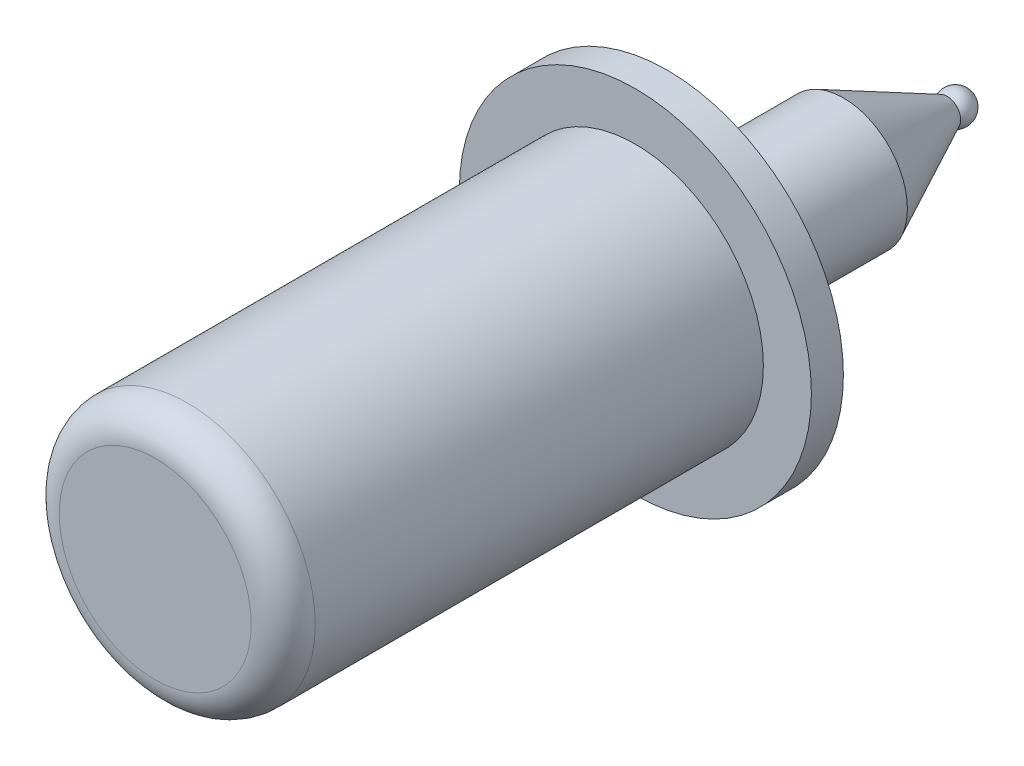
ISO-10303-21;
HEADER;
FILE_DESCRIPTION(('STEP AP214'),'2;1');
FILE_NAME('part.step','',(''),(''),'','','');
FILE_SCHEMA(('AUTOMOTIVE_DESIGN { 1 0 10303 214 1 1 1 1 }'));
ENDSEC;
DATA;
#1=APPLICATION_CONTEXT('core data for automotive mechanical design processes');
#2=APPLICATION_PROTOCOL_DEFINITION('international standard','automotive_design',2000,#1);
#3=PRODUCT_CONTEXT('',#1,'mechanical');
#4=PRODUCT('Part','Part','',(#3));
#5=PRODUCT_RELATED_PRODUCT_CATEGORY('part','',(#4));
#6=PRODUCT_DEFINITION_FORMATION('','',#4);
#7=PRODUCT_DEFINITION_CONTEXT('part definition',#1,'design');
#8=PRODUCT_DEFINITION('design','',#6,#7);
#9=PRODUCT_DEFINITION_SHAPE('','',#8);
#10=(LENGTH_UNIT() NAMED_UNIT(*) SI_UNIT(.MILLI.,.METRE.));
#11=(NAMED_UNIT(*) PLANE_ANGLE_UNIT() SI_UNIT($,.RADIAN.));
#12=(NAMED_UNIT(*) SI_UNIT($,.STERADIAN.) SOLID_ANGLE_UNIT());
#13=UNCERTAINTY_MEASURE_WITH_UNIT(LENGTH_MEASURE(1.E-05),#10,'distance_accuracy_value','');
#14=(GEOMETRIC_REPRESENTATION_CONTEXT(3) GLOBAL_UNCERTAINTY_ASSIGNED_CONTEXT((#13)) GLOBAL_UNIT_ASSIGNED_CONTEXT((#10,
#11,#12)) REPRESENTATION_CONTEXT('',''));
#15=CARTESIAN_POINT('',(0.,0.,0.));
#16=DIRECTION('',(0.,0.,1.));
#17=DIRECTION('',(1.,0.,0.));
#18=AXIS2_PLACEMENT_3D('',#15,#16,#17);
#19=CARTESIAN_POINT('',(0.,0.,-25.));
#20=DIRECTION('',(0.,0.,1.));
#21=DIRECTION('',(0.,-1.,0.));
#22=AXIS2_PLACEMENT_3D('',#19,#20,#21);
#23=SPHERICAL_SURFACE('',#22,0.5);
#24=CARTESIAN_POINT('',(0.,0.,-24.7389715071817));
#25=DIRECTION('',(0.,0.,1.));
#26=DIRECTION('',(1.,0.,0.));
#27=AXIS2_PLACEMENT_3D('',#24,#25,#26);
#28=CIRCLE('',#27,0.426455303563013);
#29=CARTESIAN_POINT('',(0.426455303563012,0.,-24.7389715071817));
#30=VERTEX_POINT('',#29);
#31=EDGE_CURVE('E10',#30,#30,#28,.T.);
#32=ORIENTED_EDGE('',*,*,#31,.F.);
#33=EDGE_LOOP('',(#32));
#34=FACE_BOUND('',#33,.T.);
#35=ADVANCED_FACE('F32',(#34),#23,.T.);
#36=CARTESIAN_POINT('',(0.,0.,-24.7389715071817));
#37=DIRECTION('',(0.,0.,1.));
#38=DIRECTION('',(1.,0.,0.));
#39=AXIS2_PLACEMENT_3D('',#36,#37,#38);
#40=CONICAL_SURFACE('',#39,0.426455303563013,0.452236286108772);
#41=CARTESIAN_POINT('',(0.,0.,-21.5));
#42=DIRECTION('',(0.,0.,1.));
#43=DIRECTION('',(1.,0.,0.));
#44=AXIS2_PLACEMENT_3D('',#41,#42,#43);
#45=CIRCLE('',#44,2.);
#46=CARTESIAN_POINT('',(2.,0.,-21.5));
#47=VERTEX_POINT('',#46);
#48=EDGE_CURVE('E38',#47,#47,#45,.T.);
#49=CARTESIAN_POINT('',(2.,0.,-21.5));
#50=CARTESIAN_POINT('',(1.98360890941212,0.,-21.5337392865331));
#51=CARTESIAN_POINT('',(1.96721781882423,0.,-21.5674785730663));
#52=CARTESIAN_POINT('',(1.93443563764846,0.,-21.6349571461326));
#53=CARTESIAN_POINT('',(1.91804454706058,0.,-21.6686964326657));
#54=CARTESIAN_POINT('',(1.8852623658848,0.,-21.736175005732));
#55=CARTESIAN_POINT('',(1.86887127529692,0.,-21.7699142922651));
#56=CARTESIAN_POINT('',(1.83608909412115,0.,-21.8373928653314));
#57=CARTESIAN_POINT('',(1.81969800353326,0.,-21.8711321518646));
#58=CARTESIAN_POINT('',(1.78691582235749,0.,-21.9386107249309));
#59=CARTESIAN_POINT('',(1.77052473176961,0.,-21.972350011464));
#60=CARTESIAN_POINT('',(1.73774255059384,0.,-22.0398285845303));
#61=CARTESIAN_POINT('',(1.72135146000595,0.,-22.0735678710634));
#62=CARTESIAN_POINT('',(1.68856927883018,0.,-22.1410464441297));
#63=CARTESIAN_POINT('',(1.6721781882423,0.,-22.1747857306629));
#64=CARTESIAN_POINT('',(1.63939600706652,0.,-22.2422643037292));
#65=CARTESIAN_POINT('',(1.62300491647864,0.,-22.2760035902623));
#66=CARTESIAN_POINT('',(1.59022273530287,0.,-22.3434821633286));
#67=CARTESIAN_POINT('',(1.57383164471498,0.,-22.3772214498617));
#68=CARTESIAN_POINT('',(1.54104946353921,0.,-22.444700022928));
#69=CARTESIAN_POINT('',(1.52465837295133,0.,-22.4784393094612));
#70=CARTESIAN_POINT('',(1.49187619177556,0.,-22.5459178825274));
#71=CARTESIAN_POINT('',(1.47548510118767,0.,-22.5796571690606));
#72=CARTESIAN_POINT('',(1.4427029200119,0.,-22.6471357421269));
#73=CARTESIAN_POINT('',(1.42631182942402,0.,-22.68087502866));
#74=CARTESIAN_POINT('',(1.39352964824824,0.,-22.7483536017263));
#75=CARTESIAN_POINT('',(1.37713855766036,0.,-22.7820928882594));
#76=CARTESIAN_POINT('',(1.34435637648459,0.,-22.8495714613257));
#77=CARTESIAN_POINT('',(1.3279652858967,0.,-22.8833107478589));
#78=CARTESIAN_POINT('',(1.29518310472093,0.,-22.9507893209251));
#79=CARTESIAN_POINT('',(1.27879201413305,0.,-22.9845286074583));
#80=CARTESIAN_POINT('',(1.24600983295728,0.,-23.0520071805246));
#81=CARTESIAN_POINT('',(1.22961874236939,0.,-23.0857464670577));
#82=CARTESIAN_POINT('',(1.19683656119362,0.,-23.153225040124));
#83=CARTESIAN_POINT('',(1.18044547060574,0.,-23.1869643266572));
#84=CARTESIAN_POINT('',(1.14766328942997,0.,-23.2544428997234));
#85=CARTESIAN_POINT('',(1.13127219884208,0.,-23.2881821862566));
#86=CARTESIAN_POINT('',(1.09849001766631,0.,-23.3556607593229));
#87=CARTESIAN_POINT('',(1.08209892707842,0.,-23.389400045856));
#88=CARTESIAN_POINT('',(1.04931674590265,0.,-23.4568786189223));
#89=CARTESIAN_POINT('',(1.03292565531477,0.,-23.4906179054554));
#90=CARTESIAN_POINT('',(1.000143474139,0.,-23.5580964785217));
#91=CARTESIAN_POINT('',(0.983752383551112,0.,-23.5918357650549));
#92=CARTESIAN_POINT('',(0.950970202375341,0.,-23.6593143381212));
#93=CARTESIAN_POINT('',(0.934579111787457,0.,-23.6930536246543));
#94=CARTESIAN_POINT('',(0.901796930611686,0.,-23.7605321977206));
#95=CARTESIAN_POINT('',(0.8854058400238,0.,-23.7942714842537));
#96=CARTESIAN_POINT('',(0.852623658848029,0.,-23.86175005732));
#97=CARTESIAN_POINT('',(0.836232568260144,0.,-23.8954893438532));
#98=CARTESIAN_POINT('',(0.803450387084374,0.,-23.9629679169194));
#99=CARTESIAN_POINT('',(0.787059296496489,0.,-23.9967072034526));
#100=CARTESIAN_POINT('',(0.754277115320718,0.,-24.0641857765189));
#101=CARTESIAN_POINT('',(0.737886024732832,0.,-24.097925063052));
#102=CARTESIAN_POINT('',(0.705103843557062,0.,-24.1654036361183));
#103=CARTESIAN_POINT('',(0.688712752969177,0.,-24.1991429226514));
#104=CARTESIAN_POINT('',(0.655930571793406,0.,-24.2666214957177));
#105=CARTESIAN_POINT('',(0.639539481205521,0.,-24.3003607822509));
#106=CARTESIAN_POINT('',(0.60675730002975,0.,-24.3678393553172));
#107=CARTESIAN_POINT('',(0.590366209441865,0.,-24.4015786418503));
#108=CARTESIAN_POINT('',(0.557584028266095,0.,-24.4690572149166));
#109=CARTESIAN_POINT('',(0.541192937678209,0.,-24.5027965014497));
#110=CARTESIAN_POINT('',(0.508410756502438,0.,-24.570275074516));
#111=CARTESIAN_POINT('',(0.492019665914553,0.,-24.6040143610492));
#112=CARTESIAN_POINT('',(0.459237484738782,0.,-24.6714929341154));
#113=CARTESIAN_POINT('',(0.442846394150897,0.,-24.7052322206486));
#114=CARTESIAN_POINT('',(0.426455303563012,0.,-24.7389715071817));
#115=B_SPLINE_CURVE_WITH_KNOTS('',3,(#49,#50,#51,#52,#53,#54,#55,#56,#57,#58,#59,#60,#61,#62,
#63,#64,#65,#66,#67,#68,#69,#70,#71,#72,#73,#74,#75,#76,#77,#78,#79,#80,#81,#82,#83,#84,#85,#86,
#87,#88,#89,#90,#91,#92,#93,#94,#95,#96,#97,#98,#99,#100,#101,#102,#103,#104,#105,#106,#107,
#108,#109,#110,#111,#112,#113,#114),.UNSPECIFIED.,.F.,.F.,(4,2,2,2,2,2,2,2,2,2,2,2,2,2,2,2,2,2,
2,2,2,2,2,2,2,2,2,2,2,2,2,2,4),(0.,0.112530288179813,0.225060576359628,0.337590864539441,
0.450121152719257,0.562651440899069,0.675181729078885,0.787712017258701,0.900242305438514,
1.01277259361833,1.12530288179814,1.23783316997796,1.35036345815777,1.46289374633759,
1.5754240345174,1.68795432269721,1.80048461087703,1.91301489905684,2.02554518723666,
2.13807547541647,2.25060576359629,2.3631360517761,2.47566633995592,2.58819662813573,
2.70072691631554,2.81325720449536,2.92578749267517,3.03831778085499,3.1508480690348,
3.26337835721462,3.37590864539443,3.48843893357425,3.60096922175406),.UNSPECIFIED.);
#116=EDGE_CURVE('BSEAM98',#47,#30,#115,.T.);
#117=ORIENTED_EDGE('',*,*,#48,.F.);
#118=ORIENTED_EDGE('',*,*,#31,.T.);
#119=ORIENTED_EDGE('',*,*,#116,.T.);
#120=ORIENTED_EDGE('',*,*,#116,.F.);
#121=EDGE_LOOP('',(#117,#119,#118,#120));
#122=FACE_BOUND('',#121,.T.);
#123=ADVANCED_FACE('F98',(#122),#40,.T.);
#124=CARTESIAN_POINT('',(0.,0.,0.));
#125=DIRECTION('',(0.,0.,1.));
#126=DIRECTION('',(1.,0.,0.));
#127=AXIS2_PLACEMENT_3D('',#124,#125,#126);
#128=CYLINDRICAL_SURFACE('',#127,2.);
#129=CARTESIAN_POINT('',(0.,0.,-16.));
#130=DIRECTION('',(0.,0.,1.));
#131=DIRECTION('',(1.,0.,0.));
#132=AXIS2_PLACEMENT_3D('',#129,#130,#131);
#133=CIRCLE('',#132,2.);
#134=CARTESIAN_POINT('',(2.,0.,-16.));
#135=VERTEX_POINT('',#134);
#136=EDGE_CURVE('E42',#135,#135,#133,.T.);
#137=ORIENTED_EDGE('',*,*,#136,.F.);
#138=EDGE_LOOP('',(#137));
#139=FACE_BOUND('',#138,.T.);
#140=ORIENTED_EDGE('',*,*,#48,.T.);
#141=EDGE_LOOP('',(#140));
#142=FACE_BOUND('',#141,.T.);
#143=ADVANCED_FACE('F93',(#139,#142),#128,.T.);
#144=CARTESIAN_POINT('',(0.,5.5,-16.));
#145=DIRECTION('',(0.,0.,1.));
#146=DIRECTION('',(1.,0.,0.));
#147=AXIS2_PLACEMENT_3D('',#144,#145,#146);
#148=PLANE('',#147);
#149=CARTESIAN_POINT('',(0.,0.,-16.));
#150=DIRECTION('',(0.,0.,1.));
#151=DIRECTION('',(1.,0.,0.));
#152=AXIS2_PLACEMENT_3D('',#149,#150,#151);
#153=CIRCLE('',#152,5.5);
#154=CARTESIAN_POINT('',(5.5,0.,-16.));
#155=VERTEX_POINT('',#154);
#156=EDGE_CURVE('E46',#155,#155,#153,.T.);
#157=ORIENTED_EDGE('',*,*,#156,.F.);
#158=EDGE_LOOP('',(#157));
#159=FACE_BOUND('',#158,.T.);
#160=ORIENTED_EDGE('',*,*,#136,.T.);
#161=EDGE_LOOP('',(#160));
#162=FACE_BOUND('',#161,.T.);
#163=ADVANCED_FACE('F87',(#159,#162),#148,.F.);
#164=CARTESIAN_POINT('',(0.,0.,0.));
#165=DIRECTION('',(0.,0.,1.));
#166=DIRECTION('',(1.,0.,0.));
#167=AXIS2_PLACEMENT_3D('',#164,#165,#166);
#168=CYLINDRICAL_SURFACE('',#167,5.5);
#169=CARTESIAN_POINT('',(0.,0.,-15.));
#170=DIRECTION('',(0.,0.,1.));
#171=DIRECTION('',(1.,0.,0.));
#172=AXIS2_PLACEMENT_3D('',#169,#170,#171);
#173=CIRCLE('',#172,5.5);
#174=CARTESIAN_POINT('',(5.5,0.,-15.));
#175=VERTEX_POINT('',#174);
#176=EDGE_CURVE('E51',#175,#175,#173,.T.);
#177=ORIENTED_EDGE('',*,*,#176,.F.);
#178=EDGE_LOOP('',(#177));
#179=FACE_BOUND('',#178,.T.);
#180=ORIENTED_EDGE('',*,*,#156,.T.);
#181=EDGE_LOOP('',(#180));
#182=FACE_BOUND('',#181,.T.);
#183=ADVANCED_FACE('F81',(#179,#182),#168,.T.);
#184=CARTESIAN_POINT('',(0.,4.,-15.));
#185=DIRECTION('',(0.,0.,-1.));
#186=DIRECTION('',(-1.,0.,0.));
#187=AXIS2_PLACEMENT_3D('',#184,#185,#186);
#188=PLANE('',#187);
#189=CARTESIAN_POINT('',(0.,0.,-15.));
#190=DIRECTION('',(0.,0.,1.));
#191=DIRECTION('',(1.,0.,0.));
#192=AXIS2_PLACEMENT_3D('',#189,#190,#191);
#193=CIRCLE('',#192,4.);
#194=CARTESIAN_POINT('',(4.,0.,-15.));
#195=VERTEX_POINT('',#194);
#196=EDGE_CURVE('E54',#195,#195,#193,.T.);
#197=ORIENTED_EDGE('',*,*,#196,.F.);
#198=EDGE_LOOP('',(#197));
#199=FACE_BOUND('',#198,.T.);
#200=ORIENTED_EDGE('',*,*,#176,.T.);
#201=EDGE_LOOP('',(#200));
#202=FACE_BOUND('',#201,.T.);
#203=ADVANCED_FACE('F75',(#199,#202),#188,.F.);
#204=CARTESIAN_POINT('',(0.,0.,0.));
#205=DIRECTION('',(0.,0.,1.));
#206=DIRECTION('',(1.,0.,0.));
#207=AXIS2_PLACEMENT_3D('',#204,#205,#206);
#208=CYLINDRICAL_SURFACE('',#207,4.);
#209=CARTESIAN_POINT('',(0.,0.,-1.));
#210=DIRECTION('',(0.,0.,1.));
#211=DIRECTION('',(1.,0.,0.));
#212=AXIS2_PLACEMENT_3D('',#209,#210,#211);
#213=CIRCLE('',#212,4.);
#214=CARTESIAN_POINT('',(4.,0.,-1.));
#215=VERTEX_POINT('',#214);
#216=EDGE_CURVE('E57',#215,#215,#213,.T.);
#217=ORIENTED_EDGE('',*,*,#216,.F.);
#218=EDGE_LOOP('',(#217));
#219=FACE_BOUND('',#218,.T.);
#220=ORIENTED_EDGE('',*,*,#196,.T.);
#221=EDGE_LOOP('',(#220));
#222=FACE_BOUND('',#221,.T.);
#223=ADVANCED_FACE('F69',(#219,#222),#208,.T.);
#224=CARTESIAN_POINT('',(0.,0.,-1.));
#225=DIRECTION('',(0.,0.,1.));
#226=DIRECTION('',(1.,0.,0.));
#227=AXIS2_PLACEMENT_3D('',#224,#225,#226);
#228=TOROIDAL_SURFACE('',#227,3.,1.);
#229=CARTESIAN_POINT('',(0.,0.,0.));
#230=DIRECTION('',(0.,0.,1.));
#231=DIRECTION('',(1.,0.,0.));
#232=AXIS2_PLACEMENT_3D('',#229,#230,#231);
#233=CIRCLE('',#232,3.);
#234=CARTESIAN_POINT('',(3.,0.,0.));
#235=VERTEX_POINT('',#234);
#236=EDGE_CURVE('E60',#235,#235,#233,.T.);
#237=ORIENTED_EDGE('',*,*,#236,.F.);
#238=EDGE_LOOP('',(#237));
#239=FACE_BOUND('',#238,.T.);
#240=ORIENTED_EDGE('',*,*,#216,.T.);
#241=EDGE_LOOP('',(#240));
#242=FACE_BOUND('',#241,.T.);
#243=ADVANCED_FACE('F66',(#239,#242),#228,.T.);
#244=CARTESIAN_POINT('',(0.,0.,0.));
#245=DIRECTION('',(0.,0.,-1.));
#246=DIRECTION('',(-1.,0.,0.));
#247=AXIS2_PLACEMENT_3D('',#244,#245,#246);
#248=PLANE('',#247);
#249=ORIENTED_EDGE('',*,*,#236,.T.);
#250=EDGE_LOOP('',(#249));
#251=FACE_BOUND('',#250,.T.);
#252=ADVANCED_FACE('F64',(#251),#248,.F.);
#253=CLOSED_SHELL('',(#35,#123,#143,#163,#183,#203,#223,#243,#252));
#254=MANIFOLD_SOLID_BREP('B2',#253);
#255=ADVANCED_BREP_SHAPE_REPRESENTATION('',(#18,#254),#14);
#256=SHAPE_DEFINITION_REPRESENTATION(#9,#255);
ENDSEC;
END-ISO-10303-21;
